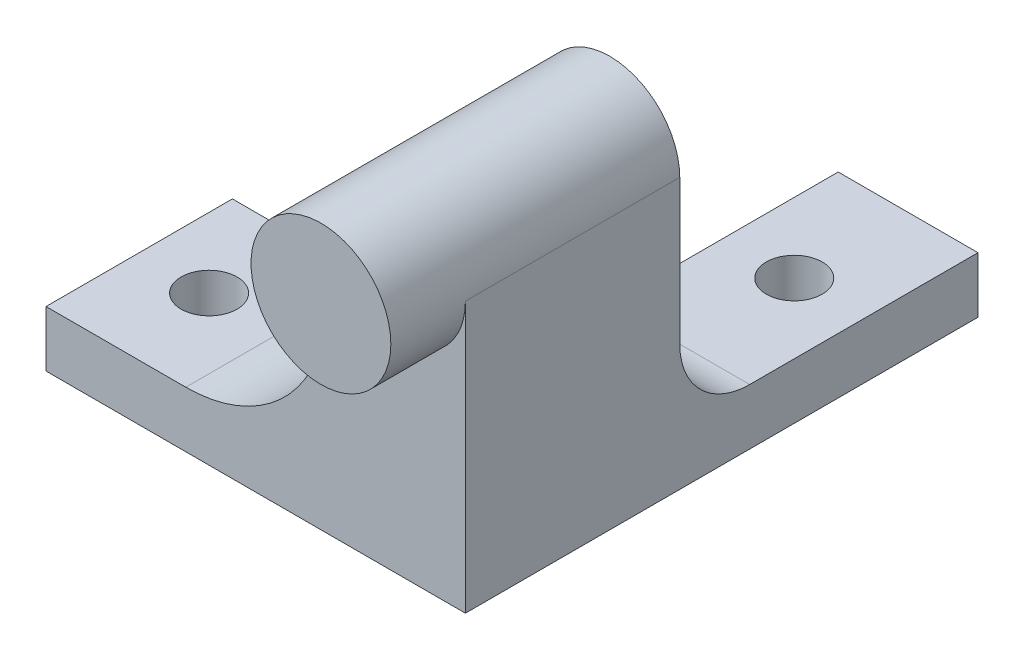
ISO-10303-21;
HEADER;
FILE_DESCRIPTION(('STEP AP214'),'2;1');
FILE_NAME('part.step','',(''),(''),'','','');
FILE_SCHEMA(('AUTOMOTIVE_DESIGN { 1 0 10303 214 1 1 1 1 }'));
ENDSEC;
DATA;
#1=APPLICATION_CONTEXT('core data for automotive mechanical design processes');
#2=APPLICATION_PROTOCOL_DEFINITION('international standard','automotive_design',2000,#1);
#3=PRODUCT_CONTEXT('',#1,'mechanical');
#4=PRODUCT('Part','Part','',(#3));
#5=PRODUCT_RELATED_PRODUCT_CATEGORY('part','',(#4));
#6=PRODUCT_DEFINITION_FORMATION('','',#4);
#7=PRODUCT_DEFINITION_CONTEXT('part definition',#1,'design');
#8=PRODUCT_DEFINITION('design','',#6,#7);
#9=PRODUCT_DEFINITION_SHAPE('','',#8);
#10=(LENGTH_UNIT() NAMED_UNIT(*) SI_UNIT(.MILLI.,.METRE.));
#11=(NAMED_UNIT(*) PLANE_ANGLE_UNIT() SI_UNIT($,.RADIAN.));
#12=(NAMED_UNIT(*) SI_UNIT($,.STERADIAN.) SOLID_ANGLE_UNIT());
#13=UNCERTAINTY_MEASURE_WITH_UNIT(LENGTH_MEASURE(1.E-05),#10,'distance_accuracy_value','');
#14=(GEOMETRIC_REPRESENTATION_CONTEXT(3) GLOBAL_UNCERTAINTY_ASSIGNED_CONTEXT((#13)) GLOBAL_UNIT_ASSIGNED_CONTEXT((#10,
#11,#12)) REPRESENTATION_CONTEXT('',''));
#15=CARTESIAN_POINT('',(0.,0.,0.));
#16=DIRECTION('',(0.,0.,1.));
#17=DIRECTION('',(1.,0.,0.));
#18=AXIS2_PLACEMENT_3D('',#15,#16,#17);
#19=CARTESIAN_POINT('',(0.,0.,0.));
#20=DIRECTION('',(0.,0.,1.));
#21=DIRECTION('',(1.,0.,0.));
#22=AXIS2_PLACEMENT_3D('',#19,#20,#21);
#23=PLANE('',#22);
#24=DIRECTION('',(0.,1.,0.));
#25=VECTOR('',#24,1.);
#26=CARTESIAN_POINT('',(-7.5,-29.,0.));
#27=LINE('',#26,#25);
#28=CARTESIAN_POINT('',(-7.5,-29.,0.));
#29=VERTEX_POINT('',#28);
#30=CARTESIAN_POINT('',(-7.5,-8.,0.));
#31=VERTEX_POINT('',#30);
#32=EDGE_CURVE('E164',#29,#31,#27,.T.);
#33=ORIENTED_EDGE('',*,*,#32,.F.);
#34=DIRECTION('',(1.,0.,0.));
#35=VECTOR('',#34,1.);
#36=CARTESIAN_POINT('',(7.5,-29.,0.));
#37=LINE('',#36,#35);
#38=CARTESIAN_POINT('',(-37.5,-29.,0.));
#39=VERTEX_POINT('',#38);
#40=EDGE_CURVE('E119',#39,#29,#37,.T.);
#41=ORIENTED_EDGE('',*,*,#40,.F.);
#42=DIRECTION('',(0.,-1.,0.));
#43=VECTOR('',#42,1.);
#44=CARTESIAN_POINT('',(-37.5,-29.,0.));
#45=LINE('',#44,#43);
#46=CARTESIAN_POINT('',(-37.5,-23.,0.));
#47=VERTEX_POINT('',#46);
#48=EDGE_CURVE('E78',#47,#39,#45,.T.);
#49=ORIENTED_EDGE('',*,*,#48,.F.);
#50=DIRECTION('',(-1.,0.,0.));
#51=VECTOR('',#50,1.);
#52=CARTESIAN_POINT('',(-37.5,-23.,0.));
#53=LINE('',#52,#51);
#54=CARTESIAN_POINT('',(-22.5,-23.,0.));
#55=VERTEX_POINT('',#54);
#56=EDGE_CURVE('E71',#55,#47,#53,.T.);
#57=ORIENTED_EDGE('',*,*,#56,.F.);
#58=CARTESIAN_POINT('',(-22.5,-8.,0.));
#59=DIRECTION('',(0.,0.,-1.));
#60=DIRECTION('',(-1.,0.,0.));
#61=AXIS2_PLACEMENT_3D('',#58,#59,#60);
#62=CIRCLE('',#61,15.);
#63=EDGE_CURVE('E114',#31,#55,#62,.T.);
#64=ORIENTED_EDGE('',*,*,#63,.F.);
#65=EDGE_LOOP('',(#33,#41,#49,#57,#64));
#66=FACE_BOUND('',#65,.T.);
#67=ADVANCED_FACE('F35',(#66),#23,.F.);
#68=CARTESIAN_POINT('',(0.,0.,20.));
#69=DIRECTION('',(0.,0.,-1.));
#70=DIRECTION('',(-1.,0.,0.));
#71=AXIS2_PLACEMENT_3D('',#68,#69,#70);
#72=CYLINDRICAL_SURFACE('',#71,7.5);
#73=DIRECTION('',(0.,0.,-1.));
#74=VECTOR('',#73,1.);
#75=CARTESIAN_POINT('',(7.5,0.,20.));
#76=LINE('',#75,#74);
#77=CARTESIAN_POINT('',(7.5,0.,20.));
#78=VERTEX_POINT('',#77);
#79=CARTESIAN_POINT('',(7.5,0.,-3.));
#80=VERTEX_POINT('',#79);
#81=EDGE_CURVE('E113',#78,#80,#76,.T.);
#82=ORIENTED_EDGE('',*,*,#81,.T.);
#83=CARTESIAN_POINT('',(0.,0.,-3.));
#84=DIRECTION('',(0.,0.,-1.));
#85=DIRECTION('',(-1.,0.,0.));
#86=AXIS2_PLACEMENT_3D('',#83,#84,#85);
#87=CIRCLE('',#86,7.5);
#88=CARTESIAN_POINT('',(-7.5,0.,-3.));
#89=VERTEX_POINT('',#88);
#90=EDGE_CURVE('E150',#89,#80,#87,.T.);
#91=ORIENTED_EDGE('',*,*,#90,.F.);
#92=DIRECTION('',(0.,0.,-1.));
#93=VECTOR('',#92,1.);
#94=CARTESIAN_POINT('',(-7.5,0.,20.));
#95=LINE('',#94,#93);
#96=CARTESIAN_POINT('',(-7.5,0.,20.));
#97=VERTEX_POINT('',#96);
#98=EDGE_CURVE('E39',#97,#89,#95,.T.);
#99=ORIENTED_EDGE('',*,*,#98,.F.);
#100=CARTESIAN_POINT('',(0.,0.,20.));
#101=DIRECTION('',(0.,0.,1.));
#102=DIRECTION('',(1.,0.,0.));
#103=AXIS2_PLACEMENT_3D('',#100,#101,#102);
#104=CIRCLE('',#103,7.5);
#105=EDGE_CURVE('E11',#97,#78,#104,.T.);
#106=ORIENTED_EDGE('',*,*,#105,.T.);
#107=EDGE_LOOP('',(#82,#91,#99,#106));
#108=FACE_BOUND('',#107,.T.);
#109=CARTESIAN_POINT('',(0.,0.,28.));
#110=DIRECTION('',(0.,0.,1.));
#111=DIRECTION('',(1.,0.,0.));
#112=AXIS2_PLACEMENT_3D('',#109,#110,#111);
#113=CIRCLE('',#112,7.5);
#114=CARTESIAN_POINT('',(7.5,0.,28.));
#115=VERTEX_POINT('',#114);
#116=EDGE_CURVE('E116',#115,#115,#113,.T.);
#117=ORIENTED_EDGE('',*,*,#116,.F.);
#118=EDGE_LOOP('',(#117));
#119=FACE_BOUND('',#118,.T.);
#120=ADVANCED_FACE('F37',(#108,#119),#72,.T.);
#121=CARTESIAN_POINT('',(-7.5,0.,20.));
#122=DIRECTION('',(1.,0.,0.));
#123=DIRECTION('',(0.,1.,0.));
#124=AXIS2_PLACEMENT_3D('',#121,#122,#123);
#125=PLANE('',#124);
#126=ORIENTED_EDGE('',*,*,#98,.T.);
#127=DIRECTION('',(0.,-1.,0.));
#128=VECTOR('',#127,1.);
#129=CARTESIAN_POINT('',(-7.5,0.,-3.));
#130=LINE('',#129,#128);
#131=CARTESIAN_POINT('',(-7.5,-15.5,-3.));
#132=VERTEX_POINT('',#131);
#133=EDGE_CURVE('E144',#89,#132,#130,.T.);
#134=ORIENTED_EDGE('',*,*,#133,.T.);
#135=CARTESIAN_POINT('',(-7.5,-15.5,-10.5));
#136=DIRECTION('',(-1.,0.,0.));
#137=DIRECTION('',(0.,0.,1.));
#138=AXIS2_PLACEMENT_3D('',#135,#136,#137);
#139=CIRCLE('',#138,7.5);
#140=CARTESIAN_POINT('',(-7.5,-23.,-10.5));
#141=VERTEX_POINT('',#140);
#142=EDGE_CURVE('E163',#141,#132,#139,.T.);
#143=ORIENTED_EDGE('',*,*,#142,.F.);
#144=DIRECTION('',(0.,0.,1.));
#145=VECTOR('',#144,1.);
#146=CARTESIAN_POINT('',(-7.5,-23.,-35.));
#147=LINE('',#146,#145);
#148=CARTESIAN_POINT('',(-7.5,-23.,-35.));
#149=VERTEX_POINT('',#148);
#150=EDGE_CURVE('E166',#149,#141,#147,.T.);
#151=ORIENTED_EDGE('',*,*,#150,.F.);
#152=DIRECTION('',(0.,1.,0.));
#153=VECTOR('',#152,1.);
#154=CARTESIAN_POINT('',(-7.5,-29.,-35.));
#155=LINE('',#154,#153);
#156=CARTESIAN_POINT('',(-7.5,-29.,-35.));
#157=VERTEX_POINT('',#156);
#158=EDGE_CURVE('E173',#157,#149,#155,.T.);
#159=ORIENTED_EDGE('',*,*,#158,.F.);
#160=DIRECTION('',(0.,0.,-1.));
#161=VECTOR('',#160,1.);
#162=CARTESIAN_POINT('',(-7.5,-29.,0.));
#163=LINE('',#162,#161);
#164=EDGE_CURVE('E176',#29,#157,#163,.T.);
#165=ORIENTED_EDGE('',*,*,#164,.F.);
#166=ORIENTED_EDGE('',*,*,#32,.T.);
#167=DIRECTION('',(0.,0.,-1.));
#168=VECTOR('',#167,1.);
#169=CARTESIAN_POINT('',(-7.5,-8.,20.));
#170=LINE('',#169,#168);
#171=CARTESIAN_POINT('',(-7.5,-8.,20.));
#172=VERTEX_POINT('',#171);
#173=EDGE_CURVE('E129',#172,#31,#170,.T.);
#174=ORIENTED_EDGE('',*,*,#173,.F.);
#175=DIRECTION('',(0.,-1.,0.));
#176=VECTOR('',#175,1.);
#177=CARTESIAN_POINT('',(-7.5,0.,20.));
#178=LINE('',#177,#176);
#179=EDGE_CURVE('E122',#97,#172,#178,.T.);
#180=ORIENTED_EDGE('',*,*,#179,.F.);
#181=EDGE_LOOP('',(#126,#134,#143,#151,#159,#165,#166,#174,#180));
#182=FACE_BOUND('',#181,.T.);
#183=ADVANCED_FACE('F140',(#182),#125,.F.);
#184=CARTESIAN_POINT('',(-22.5,-8.,20.));
#185=DIRECTION('',(0.,0.,-1.));
#186=DIRECTION('',(-1.,0.,0.));
#187=AXIS2_PLACEMENT_3D('',#184,#185,#186);
#188=CYLINDRICAL_SURFACE('',#187,15.);
#189=ORIENTED_EDGE('',*,*,#63,.T.);
#190=DIRECTION('',(0.,0.,-1.));
#191=VECTOR('',#190,1.);
#192=CARTESIAN_POINT('',(-22.5,-23.,20.));
#193=LINE('',#192,#191);
#194=CARTESIAN_POINT('',(-22.5,-23.,20.));
#195=VERTEX_POINT('',#194);
#196=EDGE_CURVE('E103',#195,#55,#193,.T.);
#197=ORIENTED_EDGE('',*,*,#196,.F.);
#198=CARTESIAN_POINT('',(-22.5,-8.,20.));
#199=DIRECTION('',(0.,0.,-1.));
#200=DIRECTION('',(-1.,0.,0.));
#201=AXIS2_PLACEMENT_3D('',#198,#199,#200);
#202=CIRCLE('',#201,15.);
#203=EDGE_CURVE('E98',#172,#195,#202,.T.);
#204=ORIENTED_EDGE('',*,*,#203,.F.);
#205=ORIENTED_EDGE('',*,*,#173,.T.);
#206=EDGE_LOOP('',(#189,#197,#204,#205));
#207=FACE_BOUND('',#206,.T.);
#208=ADVANCED_FACE('F202',(#207),#188,.F.);
#209=CARTESIAN_POINT('',(-37.5,-23.,20.));
#210=DIRECTION('',(0.,-1.,0.));
#211=DIRECTION('',(1.,0.,0.));
#212=AXIS2_PLACEMENT_3D('',#209,#210,#211);
#213=PLANE('',#212);
#214=CARTESIAN_POINT('',(-30.,-23.,10.));
#215=DIRECTION('',(0.,1.,0.));
#216=DIRECTION('',(0.,0.,1.));
#217=AXIS2_PLACEMENT_3D('',#214,#215,#216);
#218=CIRCLE('',#217,3.);
#219=CARTESIAN_POINT('',(-30.,-23.,13.));
#220=VERTEX_POINT('',#219);
#221=EDGE_CURVE('E365',#220,#220,#218,.T.);
#222=ORIENTED_EDGE('',*,*,#221,.F.);
#223=EDGE_LOOP('',(#222));
#224=FACE_BOUND('',#223,.T.);
#225=ORIENTED_EDGE('',*,*,#56,.T.);
#226=DIRECTION('',(0.,0.,-1.));
#227=VECTOR('',#226,1.);
#228=CARTESIAN_POINT('',(-37.5,-23.,20.));
#229=LINE('',#228,#227);
#230=CARTESIAN_POINT('',(-37.5,-23.,20.));
#231=VERTEX_POINT('',#230);
#232=EDGE_CURVE('E101',#231,#47,#229,.T.);
#233=ORIENTED_EDGE('',*,*,#232,.F.);
#234=DIRECTION('',(-1.,0.,0.));
#235=VECTOR('',#234,1.);
#236=CARTESIAN_POINT('',(-37.5,-23.,20.));
#237=LINE('',#236,#235);
#238=EDGE_CURVE('E93',#195,#231,#237,.T.);
#239=ORIENTED_EDGE('',*,*,#238,.F.);
#240=ORIENTED_EDGE('',*,*,#196,.T.);
#241=EDGE_LOOP('',(#225,#233,#239,#240));
#242=FACE_BOUND('',#241,.T.);
#243=ADVANCED_FACE('F102',(#224,#242),#213,.F.);
#244=CARTESIAN_POINT('',(-37.5,-29.,20.));
#245=DIRECTION('',(1.,0.,0.));
#246=DIRECTION('',(0.,1.,0.));
#247=AXIS2_PLACEMENT_3D('',#244,#245,#246);
#248=PLANE('',#247);
#249=ORIENTED_EDGE('',*,*,#48,.T.);
#250=DIRECTION('',(0.,0.,-1.));
#251=VECTOR('',#250,1.);
#252=CARTESIAN_POINT('',(-37.5,-29.,20.));
#253=LINE('',#252,#251);
#254=CARTESIAN_POINT('',(-37.5,-29.,20.));
#255=VERTEX_POINT('',#254);
#256=EDGE_CURVE('E104',#255,#39,#253,.T.);
#257=ORIENTED_EDGE('',*,*,#256,.F.);
#258=DIRECTION('',(0.,-1.,0.));
#259=VECTOR('',#258,1.);
#260=CARTESIAN_POINT('',(-37.5,-29.,20.));
#261=LINE('',#260,#259);
#262=EDGE_CURVE('E96',#231,#255,#261,.T.);
#263=ORIENTED_EDGE('',*,*,#262,.F.);
#264=ORIENTED_EDGE('',*,*,#232,.T.);
#265=EDGE_LOOP('',(#249,#257,#263,#264));
#266=FACE_BOUND('',#265,.T.);
#267=ADVANCED_FACE('F106',(#266),#248,.F.);
#268=CARTESIAN_POINT('',(7.5,-29.,20.));
#269=DIRECTION('',(0.,1.,0.));
#270=DIRECTION('',(0.,0.,1.));
#271=AXIS2_PLACEMENT_3D('',#268,#269,#270);
#272=PLANE('',#271);
#273=CARTESIAN_POINT('',(-30.,-29.,10.));
#274=DIRECTION('',(0.,1.,0.));
#275=DIRECTION('',(0.,0.,1.));
#276=AXIS2_PLACEMENT_3D('',#273,#274,#275);
#277=CIRCLE('',#276,3.);
#278=CARTESIAN_POINT('',(-30.,-29.,13.));
#279=VERTEX_POINT('',#278);
#280=EDGE_CURVE('E157',#279,#279,#277,.T.);
#281=ORIENTED_EDGE('',*,*,#280,.T.);
#282=EDGE_LOOP('',(#281));
#283=FACE_BOUND('',#282,.T.);
#284=CARTESIAN_POINT('',(0.,-29.,-22.7838103936122));
#285=DIRECTION('',(0.,1.,0.));
#286=DIRECTION('',(0.,0.,1.));
#287=AXIS2_PLACEMENT_3D('',#284,#285,#286);
#288=CIRCLE('',#287,3.);
#289=CARTESIAN_POINT('',(0.,-29.,-19.7838103936122));
#290=VERTEX_POINT('',#289);
#291=EDGE_CURVE('E370',#290,#290,#288,.T.);
#292=ORIENTED_EDGE('',*,*,#291,.T.);
#293=EDGE_LOOP('',(#292));
#294=FACE_BOUND('',#293,.T.);
#295=ORIENTED_EDGE('',*,*,#40,.T.);
#296=ORIENTED_EDGE('',*,*,#164,.T.);
#297=DIRECTION('',(1.,0.,0.));
#298=VECTOR('',#297,1.);
#299=CARTESIAN_POINT('',(-7.5,-29.,-35.));
#300=LINE('',#299,#298);
#301=CARTESIAN_POINT('',(7.5,-29.,-35.));
#302=VERTEX_POINT('',#301);
#303=EDGE_CURVE('E179',#157,#302,#300,.T.);
#304=ORIENTED_EDGE('',*,*,#303,.T.);
#305=DIRECTION('',(0.,0.,-1.));
#306=VECTOR('',#305,1.);
#307=CARTESIAN_POINT('',(7.5,-29.,20.));
#308=LINE('',#307,#306);
#309=CARTESIAN_POINT('',(7.5,-29.,20.));
#310=VERTEX_POINT('',#309);
#311=EDGE_CURVE('E125',#310,#302,#308,.T.);
#312=ORIENTED_EDGE('',*,*,#311,.F.);
#313=DIRECTION('',(1.,0.,0.));
#314=VECTOR('',#313,1.);
#315=CARTESIAN_POINT('',(7.5,-29.,20.));
#316=LINE('',#315,#314);
#317=EDGE_CURVE('E53',#255,#310,#316,.T.);
#318=ORIENTED_EDGE('',*,*,#317,.F.);
#319=ORIENTED_EDGE('',*,*,#256,.T.);
#320=EDGE_LOOP('',(#295,#296,#304,#312,#318,#319));
#321=FACE_BOUND('',#320,.T.);
#322=ADVANCED_FACE('F207',(#283,#294,#321),#272,.F.);
#323=CARTESIAN_POINT('',(7.5,-8.,20.));
#324=DIRECTION('',(-1.,0.,0.));
#325=DIRECTION('',(0.,0.,1.));
#326=AXIS2_PLACEMENT_3D('',#323,#324,#325);
#327=PLANE('',#326);
#328=ORIENTED_EDGE('',*,*,#311,.T.);
#329=DIRECTION('',(0.,1.,0.));
#330=VECTOR('',#329,1.);
#331=CARTESIAN_POINT('',(7.5,-29.,-35.));
#332=LINE('',#331,#330);
#333=CARTESIAN_POINT('',(7.5,-23.,-35.));
#334=VERTEX_POINT('',#333);
#335=EDGE_CURVE('E168',#302,#334,#332,.T.);
#336=ORIENTED_EDGE('',*,*,#335,.T.);
#337=DIRECTION('',(0.,0.,1.));
#338=VECTOR('',#337,1.);
#339=CARTESIAN_POINT('',(7.5,-23.,-35.));
#340=LINE('',#339,#338);
#341=CARTESIAN_POINT('',(7.5,-23.,-10.5));
#342=VERTEX_POINT('',#341);
#343=EDGE_CURVE('E184',#334,#342,#340,.T.);
#344=ORIENTED_EDGE('',*,*,#343,.T.);
#345=CARTESIAN_POINT('',(7.5,-15.5,-10.5));
#346=DIRECTION('',(-1.,0.,0.));
#347=DIRECTION('',(0.,0.,1.));
#348=AXIS2_PLACEMENT_3D('',#345,#346,#347);
#349=CIRCLE('',#348,7.5);
#350=CARTESIAN_POINT('',(7.5,-15.5,-3.));
#351=VERTEX_POINT('',#350);
#352=EDGE_CURVE('E181',#342,#351,#349,.T.);
#353=ORIENTED_EDGE('',*,*,#352,.T.);
#354=DIRECTION('',(0.,-1.,0.));
#355=VECTOR('',#354,1.);
#356=CARTESIAN_POINT('',(7.5,0.,-3.));
#357=LINE('',#356,#355);
#358=EDGE_CURVE('E156',#80,#351,#357,.T.);
#359=ORIENTED_EDGE('',*,*,#358,.F.);
#360=ORIENTED_EDGE('',*,*,#81,.F.);
#361=DIRECTION('',(0.,1.,0.));
#362=VECTOR('',#361,1.);
#363=CARTESIAN_POINT('',(7.5,-23.,20.));
#364=LINE('',#363,#362);
#365=EDGE_CURVE('E108',#310,#78,#364,.T.);
#366=ORIENTED_EDGE('',*,*,#365,.F.);
#367=EDGE_LOOP('',(#328,#336,#344,#353,#359,#360,#366));
#368=FACE_BOUND('',#367,.T.);
#369=ADVANCED_FACE('F237',(#368),#327,.F.);
#370=CARTESIAN_POINT('',(0.,0.,20.));
#371=DIRECTION('',(0.,0.,1.));
#372=DIRECTION('',(1.,0.,0.));
#373=AXIS2_PLACEMENT_3D('',#370,#371,#372);
#374=PLANE('',#373);
#375=ORIENTED_EDGE('',*,*,#105,.F.);
#376=ORIENTED_EDGE('',*,*,#179,.T.);
#377=ORIENTED_EDGE('',*,*,#203,.T.);
#378=ORIENTED_EDGE('',*,*,#238,.T.);
#379=ORIENTED_EDGE('',*,*,#262,.T.);
#380=ORIENTED_EDGE('',*,*,#317,.T.);
#381=ORIENTED_EDGE('',*,*,#365,.T.);
#382=EDGE_LOOP('',(#375,#376,#377,#378,#379,#380,#381));
#383=FACE_BOUND('',#382,.T.);
#384=ADVANCED_FACE('F94',(#383),#374,.T.);
#385=CARTESIAN_POINT('',(0.,0.,28.));
#386=DIRECTION('',(0.,0.,1.));
#387=DIRECTION('',(1.,0.,0.));
#388=AXIS2_PLACEMENT_3D('',#385,#386,#387);
#389=PLANE('',#388);
#390=ORIENTED_EDGE('',*,*,#116,.T.);
#391=EDGE_LOOP('',(#390));
#392=FACE_BOUND('',#391,.T.);
#393=ADVANCED_FACE('F249',(#392),#389,.T.);
#394=CARTESIAN_POINT('',(-7.5,0.,-3.));
#395=DIRECTION('',(0.,0.,1.));
#396=DIRECTION('',(0.,-1.,0.));
#397=AXIS2_PLACEMENT_3D('',#394,#395,#396);
#398=PLANE('',#397);
#399=ORIENTED_EDGE('',*,*,#133,.F.);
#400=ORIENTED_EDGE('',*,*,#90,.T.);
#401=ORIENTED_EDGE('',*,*,#358,.T.);
#402=DIRECTION('',(1.,0.,0.));
#403=VECTOR('',#402,1.);
#404=CARTESIAN_POINT('',(-7.5,-15.5,-3.));
#405=LINE('',#404,#403);
#406=EDGE_CURVE('E161',#132,#351,#405,.T.);
#407=ORIENTED_EDGE('',*,*,#406,.F.);
#408=EDGE_LOOP('',(#399,#400,#401,#407));
#409=FACE_BOUND('',#408,.T.);
#410=ADVANCED_FACE('F159',(#409),#398,.F.);
#411=CARTESIAN_POINT('',(-7.5,-15.5,-10.5));
#412=DIRECTION('',(1.,0.,0.));
#413=DIRECTION('',(0.,0.,-1.));
#414=AXIS2_PLACEMENT_3D('',#411,#412,#413);
#415=CYLINDRICAL_SURFACE('',#414,7.5);
#416=ORIENTED_EDGE('',*,*,#352,.F.);
#417=DIRECTION('',(1.,0.,0.));
#418=VECTOR('',#417,1.);
#419=CARTESIAN_POINT('',(-7.5,-23.,-10.5));
#420=LINE('',#419,#418);
#421=EDGE_CURVE('E194',#141,#342,#420,.T.);
#422=ORIENTED_EDGE('',*,*,#421,.F.);
#423=ORIENTED_EDGE('',*,*,#142,.T.);
#424=ORIENTED_EDGE('',*,*,#406,.T.);
#425=EDGE_LOOP('',(#416,#422,#423,#424));
#426=FACE_BOUND('',#425,.T.);
#427=ADVANCED_FACE('F240',(#426),#415,.F.);
#428=CARTESIAN_POINT('',(-7.5,-23.,-35.));
#429=DIRECTION('',(0.,1.,0.));
#430=DIRECTION('',(0.,0.,1.));
#431=AXIS2_PLACEMENT_3D('',#428,#429,#430);
#432=PLANE('',#431);
#433=CARTESIAN_POINT('',(0.,-23.,-22.7838103936122));
#434=DIRECTION('',(0.,1.,0.));
#435=DIRECTION('',(0.,0.,1.));
#436=AXIS2_PLACEMENT_3D('',#433,#434,#435);
#437=CIRCLE('',#436,3.);
#438=CARTESIAN_POINT('',(0.,-23.,-19.7838103936122));
#439=VERTEX_POINT('',#438);
#440=EDGE_CURVE('E366',#439,#439,#437,.T.);
#441=ORIENTED_EDGE('',*,*,#440,.F.);
#442=EDGE_LOOP('',(#441));
#443=FACE_BOUND('',#442,.T.);
#444=ORIENTED_EDGE('',*,*,#343,.F.);
#445=DIRECTION('',(1.,0.,0.));
#446=VECTOR('',#445,1.);
#447=CARTESIAN_POINT('',(-7.5,-23.,-35.));
#448=LINE('',#447,#446);
#449=EDGE_CURVE('E191',#149,#334,#448,.T.);
#450=ORIENTED_EDGE('',*,*,#449,.F.);
#451=ORIENTED_EDGE('',*,*,#150,.T.);
#452=ORIENTED_EDGE('',*,*,#421,.T.);
#453=EDGE_LOOP('',(#444,#450,#451,#452));
#454=FACE_BOUND('',#453,.T.);
#455=ADVANCED_FACE('F233',(#443,#454),#432,.T.);
#456=CARTESIAN_POINT('',(-7.5,-29.,-35.));
#457=DIRECTION('',(0.,0.,-1.));
#458=DIRECTION('',(-1.,0.,0.));
#459=AXIS2_PLACEMENT_3D('',#456,#457,#458);
#460=PLANE('',#459);
#461=ORIENTED_EDGE('',*,*,#335,.F.);
#462=ORIENTED_EDGE('',*,*,#303,.F.);
#463=ORIENTED_EDGE('',*,*,#158,.T.);
#464=ORIENTED_EDGE('',*,*,#449,.T.);
#465=EDGE_LOOP('',(#461,#462,#463,#464));
#466=FACE_BOUND('',#465,.T.);
#467=ADVANCED_FACE('F236',(#466),#460,.T.);
#468=CARTESIAN_POINT('',(0.,-29.,-22.7838103936122));
#469=DIRECTION('',(0.,1.,0.));
#470=DIRECTION('',(0.,0.,1.));
#471=AXIS2_PLACEMENT_3D('',#468,#469,#470);
#472=CYLINDRICAL_SURFACE('',#471,3.);
#473=ORIENTED_EDGE('',*,*,#291,.F.);
#474=EDGE_LOOP('',(#473));
#475=FACE_BOUND('',#474,.T.);
#476=ORIENTED_EDGE('',*,*,#440,.T.);
#477=EDGE_LOOP('',(#476));
#478=FACE_BOUND('',#477,.T.);
#479=ADVANCED_FACE('F325',(#475,#478),#472,.F.);
#480=CARTESIAN_POINT('',(-30.,-29.,10.));
#481=DIRECTION('',(0.,1.,0.));
#482=DIRECTION('',(0.,0.,1.));
#483=AXIS2_PLACEMENT_3D('',#480,#481,#482);
#484=CYLINDRICAL_SURFACE('',#483,3.);
#485=ORIENTED_EDGE('',*,*,#280,.F.);
#486=EDGE_LOOP('',(#485));
#487=FACE_BOUND('',#486,.T.);
#488=ORIENTED_EDGE('',*,*,#221,.T.);
#489=EDGE_LOOP('',(#488));
#490=FACE_BOUND('',#489,.T.);
#491=ADVANCED_FACE('F331',(#487,#490),#484,.F.);
#492=CLOSED_SHELL('',(#67,#120,#183,#208,#243,#267,#322,#369,#384,#393,#410,#427,#455,#467,#479,#491));
#493=MANIFOLD_SOLID_BREP('B2',#492);
#494=ADVANCED_BREP_SHAPE_REPRESENTATION('',(#18,#493),#14);
#495=SHAPE_DEFINITION_REPRESENTATION(#9,#494);
ENDSEC;
END-ISO-10303-21;
